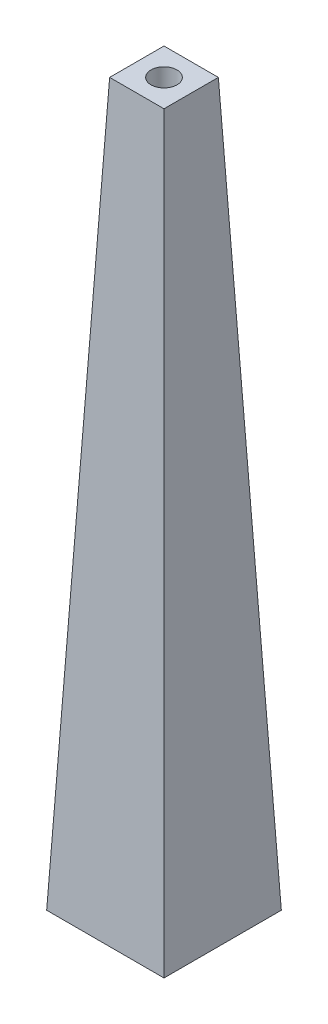
ISO-10303-21;
HEADER;
FILE_DESCRIPTION(('STEP AP214'),'2;1');
FILE_NAME('part.step','',(''),(''),'','','');
FILE_SCHEMA(('AUTOMOTIVE_DESIGN { 1 0 10303 214 1 1 1 1 }'));
ENDSEC;
DATA;
#1=APPLICATION_CONTEXT('core data for automotive mechanical design processes');
#2=APPLICATION_PROTOCOL_DEFINITION('international standard','automotive_design',2000,#1);
#3=PRODUCT_CONTEXT('',#1,'mechanical');
#4=PRODUCT('Part','Part','',(#3));
#5=PRODUCT_RELATED_PRODUCT_CATEGORY('part','',(#4));
#6=PRODUCT_DEFINITION_FORMATION('','',#4);
#7=PRODUCT_DEFINITION_CONTEXT('part definition',#1,'design');
#8=PRODUCT_DEFINITION('design','',#6,#7);
#9=PRODUCT_DEFINITION_SHAPE('','',#8);
#10=(LENGTH_UNIT() NAMED_UNIT(*) SI_UNIT(.MILLI.,.METRE.));
#11=(NAMED_UNIT(*) PLANE_ANGLE_UNIT() SI_UNIT($,.RADIAN.));
#12=(NAMED_UNIT(*) SI_UNIT($,.STERADIAN.) SOLID_ANGLE_UNIT());
#13=UNCERTAINTY_MEASURE_WITH_UNIT(LENGTH_MEASURE(1.E-05),#10,'distance_accuracy_value','');
#14=(GEOMETRIC_REPRESENTATION_CONTEXT(3) GLOBAL_UNCERTAINTY_ASSIGNED_CONTEXT((#13)) GLOBAL_UNIT_ASSIGNED_CONTEXT((#10,
#11,#12)) REPRESENTATION_CONTEXT('',''));
#15=CARTESIAN_POINT('',(0.,0.,0.));
#16=DIRECTION('',(0.,0.,1.));
#17=DIRECTION('',(1.,0.,0.));
#18=AXIS2_PLACEMENT_3D('',#15,#16,#17);
#19=CARTESIAN_POINT('',(23.8125,381.,23.8125));
#20=DIRECTION('',(0.,-1.,0.));
#21=DIRECTION('',(0.,0.,-1.));
#22=AXIS2_PLACEMENT_3D('',#19,#20,#21);
#23=CYLINDRICAL_SURFACE('',#22,3.429);
#24=CARTESIAN_POINT('',(23.8125,381.,23.8125));
#25=DIRECTION('',(0.,-1.,0.));
#26=DIRECTION('',(0.,0.,-1.));
#27=AXIS2_PLACEMENT_3D('',#24,#25,#26);
#28=CIRCLE('',#27,3.429);
#29=CARTESIAN_POINT('',(23.8125,381.,20.3835));
#30=VERTEX_POINT('',#29);
#31=EDGE_CURVE('E152',#30,#30,#28,.T.);
#32=ORIENTED_EDGE('',*,*,#31,.F.);
#33=EDGE_LOOP('',(#32));
#34=FACE_BOUND('',#33,.T.);
#35=CARTESIAN_POINT('',(23.8125,197.485,23.8125));
#36=DIRECTION('',(0.,-1.,0.));
#37=DIRECTION('',(0.,0.,-1.));
#38=AXIS2_PLACEMENT_3D('',#35,#36,#37);
#39=CIRCLE('',#38,3.429);
#40=CARTESIAN_POINT('',(23.8125,197.485,20.3835));
#41=VERTEX_POINT('',#40);
#42=EDGE_CURVE('E43',#41,#41,#39,.F.);
#43=ORIENTED_EDGE('',*,*,#42,.F.);
#44=EDGE_LOOP('',(#43));
#45=FACE_BOUND('',#44,.T.);
#46=ADVANCED_FACE('F39',(#34,#45),#23,.F.);
#47=CARTESIAN_POINT('',(0.,0.,0.));
#48=DIRECTION('',(-0.999048221581858,0.0436193873653361,0.));
#49=DIRECTION('',(-0.0436193873653361,-0.999048221581858,0.));
#50=AXIS2_PLACEMENT_3D('',#47,#48,#49);
#51=PLANE('',#50);
#52=DIRECTION('',(0.,0.,1.));
#53=VECTOR('',#52,1.);
#54=CARTESIAN_POINT('',(8.31740962407157,190.5,0.));
#55=LINE('',#54,#53);
#56=CARTESIAN_POINT('',(8.31740962407157,190.5,39.3075903759284));
#57=VERTEX_POINT('',#56);
#58=CARTESIAN_POINT('',(8.31740962407157,190.5,8.31740962407157));
#59=VERTEX_POINT('',#58);
#60=EDGE_CURVE('E64',#57,#59,#55,.F.);
#61=ORIENTED_EDGE('',*,*,#60,.F.);
#62=DIRECTION('',(-0.0435779502517479,-0.998099155647229,0.0435779502517479));
#63=VECTOR('',#62,1.);
#64=CARTESIAN_POINT('',(0.,0.,47.625));
#65=LINE('',#64,#63);
#66=CARTESIAN_POINT('',(16.6348192481431,381.,30.9901807518569));
#67=VERTEX_POINT('',#66);
#68=EDGE_CURVE('E11',#67,#57,#65,.T.);
#69=ORIENTED_EDGE('',*,*,#68,.F.);
#70=DIRECTION('',(0.,0.,-1.));
#71=VECTOR('',#70,1.);
#72=CARTESIAN_POINT('',(16.6348192481431,381.,0.));
#73=LINE('',#72,#71);
#74=CARTESIAN_POINT('',(16.6348192481431,381.,16.6348192481431));
#75=VERTEX_POINT('',#74);
#76=EDGE_CURVE('E154',#75,#67,#73,.F.);
#77=ORIENTED_EDGE('',*,*,#76,.F.);
#78=DIRECTION('',(-0.0435779502517479,-0.998099155647229,-0.0435779502517479));
#79=VECTOR('',#78,1.);
#80=CARTESIAN_POINT('',(0.,0.,0.));
#81=LINE('',#80,#79);
#82=EDGE_CURVE('E156',#75,#59,#81,.T.);
#83=ORIENTED_EDGE('',*,*,#82,.T.);
#84=EDGE_LOOP('',(#61,#69,#77,#83));
#85=FACE_BOUND('',#84,.T.);
#86=ADVANCED_FACE('F181',(#85),#51,.T.);
#87=CARTESIAN_POINT('',(0.,0.,47.625));
#88=DIRECTION('',(0.,0.0436193873653361,0.999048221581858));
#89=DIRECTION('',(0.,-0.999048221581858,0.0436193873653361));
#90=AXIS2_PLACEMENT_3D('',#87,#88,#89);
#91=PLANE('',#90);
#92=DIRECTION('',(1.,0.,0.));
#93=VECTOR('',#92,1.);
#94=CARTESIAN_POINT('',(0.,190.5,39.3075903759284));
#95=LINE('',#94,#93);
#96=CARTESIAN_POINT('',(39.3075903759284,190.5,39.3075903759284));
#97=VERTEX_POINT('',#96);
#98=EDGE_CURVE('E149',#97,#57,#95,.F.);
#99=ORIENTED_EDGE('',*,*,#98,.F.);
#100=DIRECTION('',(0.0435779502517479,-0.998099155647229,0.0435779502517479));
#101=VECTOR('',#100,1.);
#102=CARTESIAN_POINT('',(47.5345583272447,2.07145486859645,47.5345583272447));
#103=LINE('',#102,#101);
#104=CARTESIAN_POINT('',(30.9901807518569,381.,30.9901807518569));
#105=VERTEX_POINT('',#104);
#106=EDGE_CURVE('E48',#105,#97,#103,.T.);
#107=ORIENTED_EDGE('',*,*,#106,.F.);
#108=DIRECTION('',(-1.,0.,0.));
#109=VECTOR('',#108,1.);
#110=CARTESIAN_POINT('',(0.,381.,30.9901807518569));
#111=LINE('',#110,#109);
#112=EDGE_CURVE('E167',#67,#105,#111,.F.);
#113=ORIENTED_EDGE('',*,*,#112,.F.);
#114=ORIENTED_EDGE('',*,*,#68,.T.);
#115=EDGE_LOOP('',(#99,#107,#113,#114));
#116=FACE_BOUND('',#115,.T.);
#117=ADVANCED_FACE('F41',(#116),#91,.T.);
#118=CARTESIAN_POINT('',(47.625,0.,0.));
#119=DIRECTION('',(0.999048221581858,0.0436193873653361,0.));
#120=DIRECTION('',(-0.0436193873653361,0.999048221581858,0.));
#121=AXIS2_PLACEMENT_3D('',#118,#119,#120);
#122=PLANE('',#121);
#123=DIRECTION('',(0.,0.,-1.));
#124=VECTOR('',#123,1.);
#125=CARTESIAN_POINT('',(39.3075903759284,190.5,0.));
#126=LINE('',#125,#124);
#127=CARTESIAN_POINT('',(39.3075903759284,190.5,8.31740962407157));
#128=VERTEX_POINT('',#127);
#129=EDGE_CURVE('E147',#128,#97,#126,.F.);
#130=ORIENTED_EDGE('',*,*,#129,.F.);
#131=DIRECTION('',(0.0435779502517479,-0.998099155647229,-0.0435779502517479));
#132=VECTOR('',#131,1.);
#133=CARTESIAN_POINT('',(47.5345583272446,2.07145486859645,0.090441672755349));
#134=LINE('',#133,#132);
#135=CARTESIAN_POINT('',(30.9901807518569,381.,16.6348192481431));
#136=VERTEX_POINT('',#135);
#137=EDGE_CURVE('E159',#136,#128,#134,.T.);
#138=ORIENTED_EDGE('',*,*,#137,.F.);
#139=DIRECTION('',(0.,0.,1.));
#140=VECTOR('',#139,1.);
#141=CARTESIAN_POINT('',(30.9901807518569,381.,0.));
#142=LINE('',#141,#140);
#143=EDGE_CURVE('E169',#105,#136,#142,.F.);
#144=ORIENTED_EDGE('',*,*,#143,.F.);
#145=ORIENTED_EDGE('',*,*,#106,.T.);
#146=EDGE_LOOP('',(#130,#138,#144,#145));
#147=FACE_BOUND('',#146,.T.);
#148=ADVANCED_FACE('F187',(#147),#122,.T.);
#149=CARTESIAN_POINT('',(0.,0.,0.));
#150=DIRECTION('',(0.,0.0436193873653361,-0.999048221581858));
#151=DIRECTION('',(0.,0.999048221581858,0.0436193873653361));
#152=AXIS2_PLACEMENT_3D('',#149,#150,#151);
#153=PLANE('',#152);
#154=DIRECTION('',(-1.,0.,0.));
#155=VECTOR('',#154,1.);
#156=CARTESIAN_POINT('',(0.,190.5,8.31740962407157));
#157=LINE('',#156,#155);
#158=EDGE_CURVE('E145',#59,#128,#157,.F.);
#159=ORIENTED_EDGE('',*,*,#158,.F.);
#160=ORIENTED_EDGE('',*,*,#82,.F.);
#161=DIRECTION('',(1.,0.,0.));
#162=VECTOR('',#161,1.);
#163=CARTESIAN_POINT('',(0.,381.,16.6348192481431));
#164=LINE('',#163,#162);
#165=EDGE_CURVE('E160',#136,#75,#164,.F.);
#166=ORIENTED_EDGE('',*,*,#165,.F.);
#167=ORIENTED_EDGE('',*,*,#137,.T.);
#168=EDGE_LOOP('',(#159,#160,#166,#167));
#169=FACE_BOUND('',#168,.T.);
#170=ADVANCED_FACE('F179',(#169),#153,.T.);
#171=CARTESIAN_POINT('',(0.,381.,0.));
#172=DIRECTION('',(0.,1.,0.));
#173=DIRECTION('',(0.,0.,1.));
#174=AXIS2_PLACEMENT_3D('',#171,#172,#173);
#175=PLANE('',#174);
#176=ORIENTED_EDGE('',*,*,#31,.T.);
#177=EDGE_LOOP('',(#176));
#178=FACE_BOUND('',#177,.T.);
#179=ORIENTED_EDGE('',*,*,#76,.T.);
#180=ORIENTED_EDGE('',*,*,#112,.T.);
#181=ORIENTED_EDGE('',*,*,#143,.T.);
#182=ORIENTED_EDGE('',*,*,#165,.T.);
#183=EDGE_LOOP('',(#179,#180,#181,#182));
#184=FACE_BOUND('',#183,.T.);
#185=ADVANCED_FACE('F173',(#178,#184),#175,.T.);
#186=CARTESIAN_POINT('',(0.,190.5,0.));
#187=DIRECTION('',(0.,-1.,0.));
#188=DIRECTION('',(0.,0.,-1.));
#189=AXIS2_PLACEMENT_3D('',#186,#187,#188);
#190=PLANE('',#189);
#191=DIRECTION('',(0.,0.,-1.));
#192=VECTOR('',#191,1.);
#193=CARTESIAN_POINT('',(15.875,190.5,31.75));
#194=LINE('',#193,#192);
#195=CARTESIAN_POINT('',(15.875,190.5,31.75));
#196=VERTEX_POINT('',#195);
#197=CARTESIAN_POINT('',(15.875,190.5,15.875));
#198=VERTEX_POINT('',#197);
#199=EDGE_CURVE('E56',#196,#198,#194,.T.);
#200=ORIENTED_EDGE('',*,*,#199,.F.);
#201=DIRECTION('',(-1.,0.,0.));
#202=VECTOR('',#201,1.);
#203=CARTESIAN_POINT('',(15.875,190.5,31.75));
#204=LINE('',#203,#202);
#205=CARTESIAN_POINT('',(31.75,190.5,31.75));
#206=VERTEX_POINT('',#205);
#207=EDGE_CURVE('E127',#206,#196,#204,.T.);
#208=ORIENTED_EDGE('',*,*,#207,.F.);
#209=DIRECTION('',(0.,0.,1.));
#210=VECTOR('',#209,1.);
#211=CARTESIAN_POINT('',(31.75,190.5,31.75));
#212=LINE('',#211,#210);
#213=CARTESIAN_POINT('',(31.75,190.5,15.875));
#214=VERTEX_POINT('',#213);
#215=EDGE_CURVE('E110',#214,#206,#212,.T.);
#216=ORIENTED_EDGE('',*,*,#215,.F.);
#217=DIRECTION('',(1.,0.,0.));
#218=VECTOR('',#217,1.);
#219=CARTESIAN_POINT('',(15.875,190.5,15.875));
#220=LINE('',#219,#218);
#221=EDGE_CURVE('E121',#198,#214,#220,.T.);
#222=ORIENTED_EDGE('',*,*,#221,.F.);
#223=EDGE_LOOP('',(#200,#208,#216,#222));
#224=FACE_BOUND('',#223,.T.);
#225=ORIENTED_EDGE('',*,*,#60,.T.);
#226=ORIENTED_EDGE('',*,*,#158,.T.);
#227=ORIENTED_EDGE('',*,*,#129,.T.);
#228=ORIENTED_EDGE('',*,*,#98,.T.);
#229=EDGE_LOOP('',(#225,#226,#227,#228));
#230=FACE_BOUND('',#229,.T.);
#231=ADVANCED_FACE('F125',(#224,#230),#190,.T.);
#232=CARTESIAN_POINT('',(0.,197.485,0.));
#233=DIRECTION('',(0.,-1.,0.));
#234=DIRECTION('',(0.,0.,-1.));
#235=AXIS2_PLACEMENT_3D('',#232,#233,#234);
#236=PLANE('',#235);
#237=DIRECTION('',(0.,0.,-1.));
#238=VECTOR('',#237,1.);
#239=CARTESIAN_POINT('',(19.9077916302896,197.485,0.));
#240=LINE('',#239,#238);
#241=CARTESIAN_POINT('',(19.9077916302896,197.485,27.7172083697105));
#242=VERTEX_POINT('',#241);
#243=CARTESIAN_POINT('',(19.9077916302896,197.485,19.9077916302895));
#244=VERTEX_POINT('',#243);
#245=EDGE_CURVE('E129',#242,#244,#240,.T.);
#246=ORIENTED_EDGE('',*,*,#245,.T.);
#247=DIRECTION('',(1.,0.,0.));
#248=VECTOR('',#247,1.);
#249=CARTESIAN_POINT('',(0.,197.485,19.9077916302895));
#250=LINE('',#249,#248);
#251=CARTESIAN_POINT('',(27.7172083697105,197.485,19.9077916302895));
#252=VERTEX_POINT('',#251);
#253=EDGE_CURVE('E140',#244,#252,#250,.T.);
#254=ORIENTED_EDGE('',*,*,#253,.T.);
#255=DIRECTION('',(0.,0.,1.));
#256=VECTOR('',#255,1.);
#257=CARTESIAN_POINT('',(27.7172083697105,197.485,0.));
#258=LINE('',#257,#256);
#259=CARTESIAN_POINT('',(27.7172083697105,197.485,27.7172083697105));
#260=VERTEX_POINT('',#259);
#261=EDGE_CURVE('E113',#252,#260,#258,.T.);
#262=ORIENTED_EDGE('',*,*,#261,.T.);
#263=DIRECTION('',(-1.,0.,0.));
#264=VECTOR('',#263,1.);
#265=CARTESIAN_POINT('',(0.,197.485,27.7172083697104));
#266=LINE('',#265,#264);
#267=EDGE_CURVE('E135',#260,#242,#266,.T.);
#268=ORIENTED_EDGE('',*,*,#267,.T.);
#269=EDGE_LOOP('',(#246,#254,#262,#268));
#270=FACE_BOUND('',#269,.T.);
#271=ORIENTED_EDGE('',*,*,#42,.T.);
#272=EDGE_LOOP('',(#271));
#273=FACE_BOUND('',#272,.T.);
#274=ADVANCED_FACE('F189',(#270,#273),#236,.T.);
#275=CARTESIAN_POINT('',(15.875,190.5,31.75));
#276=DIRECTION('',(-0.866025403784438,0.500000000000001,0.));
#277=DIRECTION('',(-0.500000000000001,-0.866025403784438,0.));
#278=AXIS2_PLACEMENT_3D('',#275,#276,#277);
#279=PLANE('',#278);
#280=ORIENTED_EDGE('',*,*,#199,.T.);
#281=DIRECTION('',(-0.447213595499958,-0.774596669241483,-0.447213595499959));
#282=VECTOR('',#281,1.);
#283=CARTESIAN_POINT('',(19.05,195.999261314031,19.05));
#284=LINE('',#283,#282);
#285=EDGE_CURVE('E118',#244,#198,#284,.T.);
#286=ORIENTED_EDGE('',*,*,#285,.F.);
#287=ORIENTED_EDGE('',*,*,#245,.F.);
#288=DIRECTION('',(-0.447213595499959,-0.774596669241482,0.447213595499958));
#289=VECTOR('',#288,1.);
#290=CARTESIAN_POINT('',(15.875,190.5,31.75));
#291=LINE('',#290,#289);
#292=EDGE_CURVE('E133',#242,#196,#291,.T.);
#293=ORIENTED_EDGE('',*,*,#292,.T.);
#294=EDGE_LOOP('',(#280,#286,#287,#293));
#295=FACE_BOUND('',#294,.T.);
#296=ADVANCED_FACE('F195',(#295),#279,.F.);
#297=CARTESIAN_POINT('',(15.875,190.5,31.75));
#298=DIRECTION('',(0.,0.500000000000001,0.866025403784438));
#299=DIRECTION('',(0.,-0.866025403784438,0.500000000000001));
#300=AXIS2_PLACEMENT_3D('',#297,#298,#299);
#301=PLANE('',#300);
#302=ORIENTED_EDGE('',*,*,#207,.T.);
#303=ORIENTED_EDGE('',*,*,#292,.F.);
#304=ORIENTED_EDGE('',*,*,#267,.F.);
#305=DIRECTION('',(0.447213595499958,-0.774596669241482,0.447213595499959));
#306=VECTOR('',#305,1.);
#307=CARTESIAN_POINT('',(31.75,190.5,31.75));
#308=LINE('',#307,#306);
#309=EDGE_CURVE('E117',#260,#206,#308,.T.);
#310=ORIENTED_EDGE('',*,*,#309,.T.);
#311=EDGE_LOOP('',(#302,#303,#304,#310));
#312=FACE_BOUND('',#311,.T.);
#313=ADVANCED_FACE('F263',(#312),#301,.F.);
#314=CARTESIAN_POINT('',(31.75,190.5,31.75));
#315=DIRECTION('',(0.866025403784438,0.500000000000001,0.));
#316=DIRECTION('',(-0.500000000000001,0.866025403784438,0.));
#317=AXIS2_PLACEMENT_3D('',#314,#315,#316);
#318=PLANE('',#317);
#319=ORIENTED_EDGE('',*,*,#215,.T.);
#320=ORIENTED_EDGE('',*,*,#309,.F.);
#321=ORIENTED_EDGE('',*,*,#261,.F.);
#322=DIRECTION('',(0.447213595499959,-0.774596669241482,-0.447213595499959));
#323=VECTOR('',#322,1.);
#324=CARTESIAN_POINT('',(28.575,195.999261314031,19.05));
#325=LINE('',#324,#323);
#326=EDGE_CURVE('E106',#252,#214,#325,.T.);
#327=ORIENTED_EDGE('',*,*,#326,.T.);
#328=EDGE_LOOP('',(#319,#320,#321,#327));
#329=FACE_BOUND('',#328,.T.);
#330=ADVANCED_FACE('F108',(#329),#318,.F.);
#331=CARTESIAN_POINT('',(15.875,190.5,15.875));
#332=DIRECTION('',(0.,0.500000000000001,-0.866025403784438));
#333=DIRECTION('',(0.,0.866025403784438,0.500000000000001));
#334=AXIS2_PLACEMENT_3D('',#331,#332,#333);
#335=PLANE('',#334);
#336=ORIENTED_EDGE('',*,*,#221,.T.);
#337=ORIENTED_EDGE('',*,*,#326,.F.);
#338=ORIENTED_EDGE('',*,*,#253,.F.);
#339=ORIENTED_EDGE('',*,*,#285,.T.);
#340=EDGE_LOOP('',(#336,#337,#338,#339));
#341=FACE_BOUND('',#340,.T.);
#342=ADVANCED_FACE('F122',(#341),#335,.F.);
#343=CLOSED_SHELL('',(#46,#86,#117,#148,#170,#185,#231,#274,#296,#313,#330,#342));
#344=MANIFOLD_SOLID_BREP('B2',#343);
#345=ADVANCED_BREP_SHAPE_REPRESENTATION('',(#18,#344),#14);
#346=SHAPE_DEFINITION_REPRESENTATION(#9,#345);
ENDSEC;
END-ISO-10303-21;
